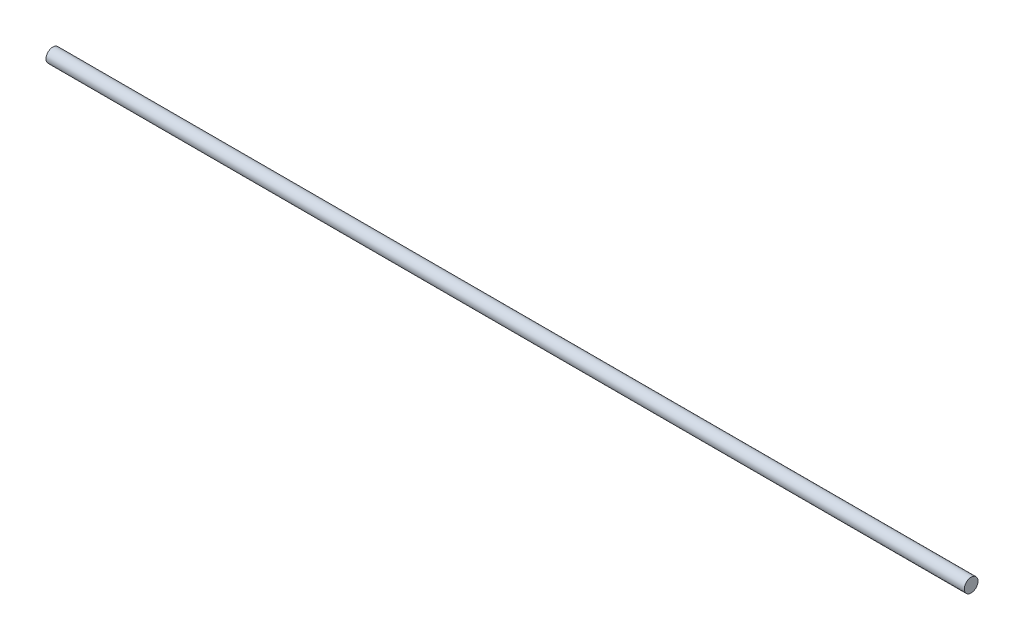
ISO-10303-21;
HEADER;
FILE_DESCRIPTION(('STEP AP214'),'2;1');
FILE_NAME('part.step','',(''),(''),'','','');
FILE_SCHEMA(('AUTOMOTIVE_DESIGN { 1 0 10303 214 1 1 1 1 }'));
ENDSEC;
DATA;
#1=APPLICATION_CONTEXT('core data for automotive mechanical design processes');
#2=APPLICATION_PROTOCOL_DEFINITION('international standard','automotive_design',2000,#1);
#3=PRODUCT_CONTEXT('',#1,'mechanical');
#4=PRODUCT('Part','Part','',(#3));
#5=PRODUCT_RELATED_PRODUCT_CATEGORY('part','',(#4));
#6=PRODUCT_DEFINITION_FORMATION('','',#4);
#7=PRODUCT_DEFINITION_CONTEXT('part definition',#1,'design');
#8=PRODUCT_DEFINITION('design','',#6,#7);
#9=PRODUCT_DEFINITION_SHAPE('','',#8);
#10=(LENGTH_UNIT() NAMED_UNIT(*) SI_UNIT(.MILLI.,.METRE.));
#11=(NAMED_UNIT(*) PLANE_ANGLE_UNIT() SI_UNIT($,.RADIAN.));
#12=(NAMED_UNIT(*) SI_UNIT($,.STERADIAN.) SOLID_ANGLE_UNIT());
#13=UNCERTAINTY_MEASURE_WITH_UNIT(LENGTH_MEASURE(1.E-05),#10,'distance_accuracy_value','');
#14=(GEOMETRIC_REPRESENTATION_CONTEXT(3) GLOBAL_UNCERTAINTY_ASSIGNED_CONTEXT((#13)) GLOBAL_UNIT_ASSIGNED_CONTEXT((#10,
#11,#12)) REPRESENTATION_CONTEXT('',''));
#15=CARTESIAN_POINT('',(0.,0.,0.));
#16=DIRECTION('',(0.,0.,1.));
#17=DIRECTION('',(1.,0.,0.));
#18=AXIS2_PLACEMENT_3D('',#15,#16,#17);
#19=CARTESIAN_POINT('',(-61.,6.1145,2.9145));
#20=DIRECTION('',(-1.,0.,0.));
#21=DIRECTION('',(0.,0.,1.));
#22=AXIS2_PLACEMENT_3D('',#19,#20,#21);
#23=PLANE('',#22);
#24=CARTESIAN_POINT('',(-61.,6.99999999999954,3.8));
#25=DIRECTION('',(-1.,0.,0.));
#26=DIRECTION('',(0.,-1.,0.));
#27=AXIS2_PLACEMENT_3D('',#24,#25,#26);
#28=CIRCLE('',#27,0.875);
#29=CARTESIAN_POINT('',(-61.,6.12499999999954,3.8));
#30=VERTEX_POINT('',#29);
#31=EDGE_CURVE('E18',#30,#30,#28,.T.);
#32=ORIENTED_EDGE('',*,*,#31,.T.);
#33=EDGE_LOOP('',(#32));
#34=FACE_BOUND('',#33,.T.);
#35=ADVANCED_FACE('F14',(#34),#23,.T.);
#36=CARTESIAN_POINT('',(56.,6.1145,2.9145));
#37=DIRECTION('',(-1.,0.,0.));
#38=DIRECTION('',(0.,0.,1.));
#39=AXIS2_PLACEMENT_3D('',#36,#37,#38);
#40=PLANE('',#39);
#41=CARTESIAN_POINT('',(56.,7.,3.8));
#42=DIRECTION('',(-1.,0.,0.));
#43=DIRECTION('',(0.,-1.,0.));
#44=AXIS2_PLACEMENT_3D('',#41,#42,#43);
#45=CIRCLE('',#44,0.875);
#46=CARTESIAN_POINT('',(56.,6.125,3.8));
#47=VERTEX_POINT('',#46);
#48=EDGE_CURVE('E9',#47,#47,#45,.F.);
#49=ORIENTED_EDGE('',*,*,#48,.T.);
#50=EDGE_LOOP('',(#49));
#51=FACE_BOUND('',#50,.T.);
#52=ADVANCED_FACE('F16',(#51),#40,.F.);
#53=CARTESIAN_POINT('',(56.,7.,3.8));
#54=DIRECTION('',(-1.,0.,0.));
#55=DIRECTION('',(0.,-1.,0.));
#56=AXIS2_PLACEMENT_3D('',#53,#54,#55);
#57=CYLINDRICAL_SURFACE('',#56,0.875);
#58=ORIENTED_EDGE('',*,*,#31,.F.);
#59=EDGE_LOOP('',(#58));
#60=FACE_BOUND('',#59,.T.);
#61=ORIENTED_EDGE('',*,*,#48,.F.);
#62=EDGE_LOOP('',(#61));
#63=FACE_BOUND('',#62,.T.);
#64=ADVANCED_FACE('F28',(#60,#63),#57,.T.);
#65=CLOSED_SHELL('',(#35,#52,#64));
#66=MANIFOLD_SOLID_BREP('B1',#65);
#67=ADVANCED_BREP_SHAPE_REPRESENTATION('',(#18,#66),#14);
#68=SHAPE_DEFINITION_REPRESENTATION(#9,#67);
ENDSEC;
END-ISO-10303-21;
